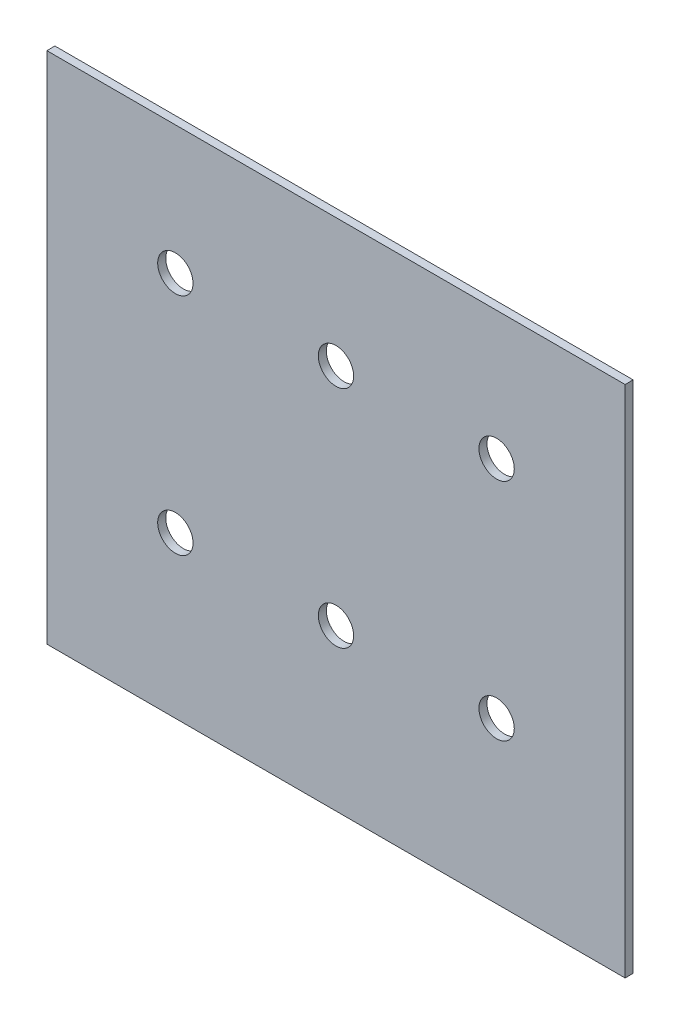
ISO-10303-21;
HEADER;
FILE_DESCRIPTION(('STEP AP214'),'2;1');
FILE_NAME('part.step','',(''),(''),'','','');
FILE_SCHEMA(('AUTOMOTIVE_DESIGN { 1 0 10303 214 1 1 1 1 }'));
ENDSEC;
DATA;
#1=APPLICATION_CONTEXT('core data for automotive mechanical design processes');
#2=APPLICATION_PROTOCOL_DEFINITION('international standard','automotive_design',2000,#1);
#3=PRODUCT_CONTEXT('',#1,'mechanical');
#4=PRODUCT('Part','Part','',(#3));
#5=PRODUCT_RELATED_PRODUCT_CATEGORY('part','',(#4));
#6=PRODUCT_DEFINITION_FORMATION('','',#4);
#7=PRODUCT_DEFINITION_CONTEXT('part definition',#1,'design');
#8=PRODUCT_DEFINITION('design','',#6,#7);
#9=PRODUCT_DEFINITION_SHAPE('','',#8);
#10=(LENGTH_UNIT() NAMED_UNIT(*) SI_UNIT(.MILLI.,.METRE.));
#11=(NAMED_UNIT(*) PLANE_ANGLE_UNIT() SI_UNIT($,.RADIAN.));
#12=(NAMED_UNIT(*) SI_UNIT($,.STERADIAN.) SOLID_ANGLE_UNIT());
#13=UNCERTAINTY_MEASURE_WITH_UNIT(LENGTH_MEASURE(1.E-05),#10,'distance_accuracy_value','');
#14=(GEOMETRIC_REPRESENTATION_CONTEXT(3) GLOBAL_UNCERTAINTY_ASSIGNED_CONTEXT((#13)) GLOBAL_UNIT_ASSIGNED_CONTEXT((#10,
#11,#12)) REPRESENTATION_CONTEXT('',''));
#15=CARTESIAN_POINT('',(0.,0.,0.));
#16=DIRECTION('',(0.,0.,1.));
#17=DIRECTION('',(1.,0.,0.));
#18=AXIS2_PLACEMENT_3D('',#15,#16,#17);
#19=CARTESIAN_POINT('',(0.,0.,5.));
#20=DIRECTION('',(0.,0.,1.));
#21=DIRECTION('',(1.,0.,0.));
#22=AXIS2_PLACEMENT_3D('',#19,#20,#21);
#23=PLANE('',#22);
#24=CARTESIAN_POINT('',(100.,-60.,5.));
#25=DIRECTION('',(0.,0.,1.));
#26=DIRECTION('',(1.,0.,0.));
#27=AXIS2_PLACEMENT_3D('',#24,#25,#26);
#28=CIRCLE('',#27,11.);
#29=CARTESIAN_POINT('',(111.,-60.,5.));
#30=VERTEX_POINT('',#29);
#31=EDGE_CURVE('E133',#30,#30,#28,.T.);
#32=ORIENTED_EDGE('',*,*,#31,.F.);
#33=EDGE_LOOP('',(#32));
#34=FACE_BOUND('',#33,.T.);
#35=CARTESIAN_POINT('',(-100.,80.,5.));
#36=DIRECTION('',(0.,0.,1.));
#37=DIRECTION('',(1.,0.,0.));
#38=AXIS2_PLACEMENT_3D('',#35,#36,#37);
#39=CIRCLE('',#38,11.);
#40=CARTESIAN_POINT('',(-89.,80.,5.));
#41=VERTEX_POINT('',#40);
#42=EDGE_CURVE('E121',#41,#41,#39,.T.);
#43=ORIENTED_EDGE('',*,*,#42,.F.);
#44=EDGE_LOOP('',(#43));
#45=FACE_BOUND('',#44,.T.);
#46=CARTESIAN_POINT('',(0.,80.,5.));
#47=DIRECTION('',(0.,0.,1.));
#48=DIRECTION('',(1.,0.,0.));
#49=AXIS2_PLACEMENT_3D('',#46,#47,#48);
#50=CIRCLE('',#49,11.);
#51=CARTESIAN_POINT('',(11.,80.,5.));
#52=VERTEX_POINT('',#51);
#53=EDGE_CURVE('E100',#52,#52,#50,.T.);
#54=ORIENTED_EDGE('',*,*,#53,.F.);
#55=EDGE_LOOP('',(#54));
#56=FACE_BOUND('',#55,.T.);
#57=DIRECTION('',(0.,1.,0.));
#58=VECTOR('',#57,1.);
#59=CARTESIAN_POINT('',(180.,160.,5.));
#60=LINE('',#59,#58);
#61=CARTESIAN_POINT('',(180.,-160.,5.));
#62=VERTEX_POINT('',#61);
#63=CARTESIAN_POINT('',(180.,160.,5.));
#64=VERTEX_POINT('',#63);
#65=EDGE_CURVE('E85',#62,#64,#60,.T.);
#66=ORIENTED_EDGE('',*,*,#65,.T.);
#67=DIRECTION('',(-1.,0.,0.));
#68=VECTOR('',#67,1.);
#69=CARTESIAN_POINT('',(-180.,160.,5.));
#70=LINE('',#69,#68);
#71=CARTESIAN_POINT('',(-180.,160.,5.));
#72=VERTEX_POINT('',#71);
#73=EDGE_CURVE('E80',#64,#72,#70,.T.);
#74=ORIENTED_EDGE('',*,*,#73,.T.);
#75=DIRECTION('',(0.,-1.,0.));
#76=VECTOR('',#75,1.);
#77=CARTESIAN_POINT('',(-180.,160.,5.));
#78=LINE('',#77,#76);
#79=CARTESIAN_POINT('',(-180.,-160.,5.));
#80=VERTEX_POINT('',#79);
#81=EDGE_CURVE('E83',#72,#80,#78,.T.);
#82=ORIENTED_EDGE('',*,*,#81,.T.);
#83=DIRECTION('',(1.,0.,0.));
#84=VECTOR('',#83,1.);
#85=CARTESIAN_POINT('',(-180.,-160.,5.));
#86=LINE('',#85,#84);
#87=EDGE_CURVE('E50',#80,#62,#86,.T.);
#88=ORIENTED_EDGE('',*,*,#87,.T.);
#89=EDGE_LOOP('',(#66,#74,#82,#88));
#90=FACE_BOUND('',#89,.T.);
#91=CARTESIAN_POINT('',(100.,80.,5.));
#92=DIRECTION('',(0.,0.,1.));
#93=DIRECTION('',(1.,0.,0.));
#94=AXIS2_PLACEMENT_3D('',#91,#92,#93);
#95=CIRCLE('',#94,11.);
#96=CARTESIAN_POINT('',(111.,80.,5.));
#97=VERTEX_POINT('',#96);
#98=EDGE_CURVE('E115',#97,#97,#95,.T.);
#99=ORIENTED_EDGE('',*,*,#98,.F.);
#100=EDGE_LOOP('',(#99));
#101=FACE_BOUND('',#100,.T.);
#102=CARTESIAN_POINT('',(0.,-60.,5.));
#103=DIRECTION('',(0.,0.,1.));
#104=DIRECTION('',(1.,0.,0.));
#105=AXIS2_PLACEMENT_3D('',#102,#103,#104);
#106=CIRCLE('',#105,11.);
#107=CARTESIAN_POINT('',(11.0000000000001,-60.,5.));
#108=VERTEX_POINT('',#107);
#109=EDGE_CURVE('E127',#108,#108,#106,.T.);
#110=ORIENTED_EDGE('',*,*,#109,.F.);
#111=EDGE_LOOP('',(#110));
#112=FACE_BOUND('',#111,.T.);
#113=CARTESIAN_POINT('',(-99.9999999999999,-60.,5.));
#114=DIRECTION('',(0.,0.,1.));
#115=DIRECTION('',(1.,0.,0.));
#116=AXIS2_PLACEMENT_3D('',#113,#114,#115);
#117=CIRCLE('',#116,11.);
#118=CARTESIAN_POINT('',(-89.,-60.,5.));
#119=VERTEX_POINT('',#118);
#120=EDGE_CURVE('E139',#119,#119,#117,.T.);
#121=ORIENTED_EDGE('',*,*,#120,.F.);
#122=EDGE_LOOP('',(#121));
#123=FACE_BOUND('',#122,.T.);
#124=ADVANCED_FACE('F33',(#34,#45,#56,#90,#101,#112,#123),#23,.T.);
#125=CARTESIAN_POINT('',(0.,0.,0.));
#126=DIRECTION('',(0.,0.,1.));
#127=DIRECTION('',(1.,0.,0.));
#128=AXIS2_PLACEMENT_3D('',#125,#126,#127);
#129=PLANE('',#128);
#130=DIRECTION('',(0.,1.,0.));
#131=VECTOR('',#130,1.);
#132=CARTESIAN_POINT('',(180.,160.,0.));
#133=LINE('',#132,#131);
#134=CARTESIAN_POINT('',(180.,-160.,0.));
#135=VERTEX_POINT('',#134);
#136=CARTESIAN_POINT('',(180.,160.,0.));
#137=VERTEX_POINT('',#136);
#138=EDGE_CURVE('E97',#135,#137,#133,.T.);
#139=ORIENTED_EDGE('',*,*,#138,.F.);
#140=DIRECTION('',(1.,0.,0.));
#141=VECTOR('',#140,1.);
#142=CARTESIAN_POINT('',(-180.,-160.,0.));
#143=LINE('',#142,#141);
#144=CARTESIAN_POINT('',(-180.,-160.,0.));
#145=VERTEX_POINT('',#144);
#146=EDGE_CURVE('E73',#145,#135,#143,.T.);
#147=ORIENTED_EDGE('',*,*,#146,.F.);
#148=DIRECTION('',(0.,-1.,0.));
#149=VECTOR('',#148,1.);
#150=CARTESIAN_POINT('',(-180.,160.,0.));
#151=LINE('',#150,#149);
#152=CARTESIAN_POINT('',(-180.,160.,0.));
#153=VERTEX_POINT('',#152);
#154=EDGE_CURVE('E67',#153,#145,#151,.T.);
#155=ORIENTED_EDGE('',*,*,#154,.F.);
#156=DIRECTION('',(-1.,0.,0.));
#157=VECTOR('',#156,1.);
#158=CARTESIAN_POINT('',(-180.,160.,0.));
#159=LINE('',#158,#157);
#160=EDGE_CURVE('E89',#137,#153,#159,.T.);
#161=ORIENTED_EDGE('',*,*,#160,.F.);
#162=EDGE_LOOP('',(#139,#147,#155,#161));
#163=FACE_BOUND('',#162,.T.);
#164=CARTESIAN_POINT('',(0.,80.,0.));
#165=DIRECTION('',(0.,0.,1.));
#166=DIRECTION('',(1.,0.,0.));
#167=AXIS2_PLACEMENT_3D('',#164,#165,#166);
#168=CIRCLE('',#167,11.);
#169=CARTESIAN_POINT('',(11.,80.,0.));
#170=VERTEX_POINT('',#169);
#171=EDGE_CURVE('E112',#170,#170,#168,.T.);
#172=ORIENTED_EDGE('',*,*,#171,.T.);
#173=EDGE_LOOP('',(#172));
#174=FACE_BOUND('',#173,.T.);
#175=CARTESIAN_POINT('',(100.,80.,0.));
#176=DIRECTION('',(0.,0.,1.));
#177=DIRECTION('',(1.,0.,0.));
#178=AXIS2_PLACEMENT_3D('',#175,#176,#177);
#179=CIRCLE('',#178,11.);
#180=CARTESIAN_POINT('',(111.,80.,0.));
#181=VERTEX_POINT('',#180);
#182=EDGE_CURVE('E118',#181,#181,#179,.T.);
#183=ORIENTED_EDGE('',*,*,#182,.T.);
#184=EDGE_LOOP('',(#183));
#185=FACE_BOUND('',#184,.T.);
#186=CARTESIAN_POINT('',(-100.,80.,0.));
#187=DIRECTION('',(0.,0.,1.));
#188=DIRECTION('',(1.,0.,0.));
#189=AXIS2_PLACEMENT_3D('',#186,#187,#188);
#190=CIRCLE('',#189,11.);
#191=CARTESIAN_POINT('',(-89.,80.,0.));
#192=VERTEX_POINT('',#191);
#193=EDGE_CURVE('E124',#192,#192,#190,.T.);
#194=ORIENTED_EDGE('',*,*,#193,.T.);
#195=EDGE_LOOP('',(#194));
#196=FACE_BOUND('',#195,.T.);
#197=CARTESIAN_POINT('',(0.,-60.,0.));
#198=DIRECTION('',(0.,0.,1.));
#199=DIRECTION('',(1.,0.,0.));
#200=AXIS2_PLACEMENT_3D('',#197,#198,#199);
#201=CIRCLE('',#200,11.);
#202=CARTESIAN_POINT('',(11.0000000000001,-60.,0.));
#203=VERTEX_POINT('',#202);
#204=EDGE_CURVE('E130',#203,#203,#201,.T.);
#205=ORIENTED_EDGE('',*,*,#204,.T.);
#206=EDGE_LOOP('',(#205));
#207=FACE_BOUND('',#206,.T.);
#208=CARTESIAN_POINT('',(100.,-60.,0.));
#209=DIRECTION('',(0.,0.,1.));
#210=DIRECTION('',(1.,0.,0.));
#211=AXIS2_PLACEMENT_3D('',#208,#209,#210);
#212=CIRCLE('',#211,11.);
#213=CARTESIAN_POINT('',(111.,-60.,0.));
#214=VERTEX_POINT('',#213);
#215=EDGE_CURVE('E136',#214,#214,#212,.T.);
#216=ORIENTED_EDGE('',*,*,#215,.T.);
#217=EDGE_LOOP('',(#216));
#218=FACE_BOUND('',#217,.T.);
#219=CARTESIAN_POINT('',(-99.9999999999999,-60.,0.));
#220=DIRECTION('',(0.,0.,1.));
#221=DIRECTION('',(1.,0.,0.));
#222=AXIS2_PLACEMENT_3D('',#219,#220,#221);
#223=CIRCLE('',#222,11.);
#224=CARTESIAN_POINT('',(-89.,-60.,0.));
#225=VERTEX_POINT('',#224);
#226=EDGE_CURVE('E142',#225,#225,#223,.T.);
#227=ORIENTED_EDGE('',*,*,#226,.T.);
#228=EDGE_LOOP('',(#227));
#229=FACE_BOUND('',#228,.T.);
#230=ADVANCED_FACE('F108',(#163,#174,#185,#196,#207,#218,#229),#129,.F.);
#231=CARTESIAN_POINT('',(180.,160.,5.));
#232=DIRECTION('',(-1.,0.,0.));
#233=DIRECTION('',(0.,-1.,0.));
#234=AXIS2_PLACEMENT_3D('',#231,#232,#233);
#235=PLANE('',#234);
#236=ORIENTED_EDGE('',*,*,#138,.T.);
#237=DIRECTION('',(0.,0.,-1.));
#238=VECTOR('',#237,1.);
#239=CARTESIAN_POINT('',(180.,160.,5.));
#240=LINE('',#239,#238);
#241=EDGE_CURVE('E11',#64,#137,#240,.T.);
#242=ORIENTED_EDGE('',*,*,#241,.F.);
#243=ORIENTED_EDGE('',*,*,#65,.F.);
#244=DIRECTION('',(0.,0.,-1.));
#245=VECTOR('',#244,1.);
#246=CARTESIAN_POINT('',(180.,-160.,5.));
#247=LINE('',#246,#245);
#248=EDGE_CURVE('E93',#62,#135,#247,.T.);
#249=ORIENTED_EDGE('',*,*,#248,.T.);
#250=EDGE_LOOP('',(#236,#242,#243,#249));
#251=FACE_BOUND('',#250,.T.);
#252=ADVANCED_FACE('F35',(#251),#235,.F.);
#253=CARTESIAN_POINT('',(-180.,160.,5.));
#254=DIRECTION('',(0.,-1.,0.));
#255=DIRECTION('',(0.,0.,-1.));
#256=AXIS2_PLACEMENT_3D('',#253,#254,#255);
#257=PLANE('',#256);
#258=ORIENTED_EDGE('',*,*,#160,.T.);
#259=DIRECTION('',(0.,0.,-1.));
#260=VECTOR('',#259,1.);
#261=CARTESIAN_POINT('',(-180.,160.,5.));
#262=LINE('',#261,#260);
#263=EDGE_CURVE('E42',#72,#153,#262,.T.);
#264=ORIENTED_EDGE('',*,*,#263,.F.);
#265=ORIENTED_EDGE('',*,*,#73,.F.);
#266=ORIENTED_EDGE('',*,*,#241,.T.);
#267=EDGE_LOOP('',(#258,#264,#265,#266));
#268=FACE_BOUND('',#267,.T.);
#269=ADVANCED_FACE('F88',(#268),#257,.F.);
#270=CARTESIAN_POINT('',(-180.,160.,5.));
#271=DIRECTION('',(1.,0.,0.));
#272=DIRECTION('',(0.,1.,0.));
#273=AXIS2_PLACEMENT_3D('',#270,#271,#272);
#274=PLANE('',#273);
#275=ORIENTED_EDGE('',*,*,#154,.T.);
#276=DIRECTION('',(0.,0.,-1.));
#277=VECTOR('',#276,1.);
#278=CARTESIAN_POINT('',(-180.,-160.,5.));
#279=LINE('',#278,#277);
#280=EDGE_CURVE('E90',#80,#145,#279,.T.);
#281=ORIENTED_EDGE('',*,*,#280,.F.);
#282=ORIENTED_EDGE('',*,*,#81,.F.);
#283=ORIENTED_EDGE('',*,*,#263,.T.);
#284=EDGE_LOOP('',(#275,#281,#282,#283));
#285=FACE_BOUND('',#284,.T.);
#286=ADVANCED_FACE('F91',(#285),#274,.F.);
#287=CARTESIAN_POINT('',(-180.,-160.,5.));
#288=DIRECTION('',(0.,1.,0.));
#289=DIRECTION('',(0.,0.,1.));
#290=AXIS2_PLACEMENT_3D('',#287,#288,#289);
#291=PLANE('',#290);
#292=ORIENTED_EDGE('',*,*,#146,.T.);
#293=ORIENTED_EDGE('',*,*,#248,.F.);
#294=ORIENTED_EDGE('',*,*,#87,.F.);
#295=ORIENTED_EDGE('',*,*,#280,.T.);
#296=EDGE_LOOP('',(#292,#293,#294,#295));
#297=FACE_BOUND('',#296,.T.);
#298=ADVANCED_FACE('F105',(#297),#291,.F.);
#299=CARTESIAN_POINT('',(0.,80.,5.));
#300=DIRECTION('',(0.,0.,-1.));
#301=DIRECTION('',(-1.,0.,0.));
#302=AXIS2_PLACEMENT_3D('',#299,#300,#301);
#303=CYLINDRICAL_SURFACE('',#302,11.);
#304=ORIENTED_EDGE('',*,*,#53,.T.);
#305=EDGE_LOOP('',(#304));
#306=FACE_BOUND('',#305,.T.);
#307=ORIENTED_EDGE('',*,*,#171,.F.);
#308=EDGE_LOOP('',(#307));
#309=FACE_BOUND('',#308,.T.);
#310=ADVANCED_FACE('F161',(#306,#309),#303,.F.);
#311=CARTESIAN_POINT('',(100.,80.,5.));
#312=DIRECTION('',(0.,0.,-1.));
#313=DIRECTION('',(-1.,0.,0.));
#314=AXIS2_PLACEMENT_3D('',#311,#312,#313);
#315=CYLINDRICAL_SURFACE('',#314,11.);
#316=ORIENTED_EDGE('',*,*,#98,.T.);
#317=EDGE_LOOP('',(#316));
#318=FACE_BOUND('',#317,.T.);
#319=ORIENTED_EDGE('',*,*,#182,.F.);
#320=EDGE_LOOP('',(#319));
#321=FACE_BOUND('',#320,.T.);
#322=ADVANCED_FACE('F207',(#318,#321),#315,.F.);
#323=CARTESIAN_POINT('',(-100.,80.,5.));
#324=DIRECTION('',(0.,0.,-1.));
#325=DIRECTION('',(-1.,0.,0.));
#326=AXIS2_PLACEMENT_3D('',#323,#324,#325);
#327=CYLINDRICAL_SURFACE('',#326,11.);
#328=ORIENTED_EDGE('',*,*,#42,.T.);
#329=EDGE_LOOP('',(#328));
#330=FACE_BOUND('',#329,.T.);
#331=ORIENTED_EDGE('',*,*,#193,.F.);
#332=EDGE_LOOP('',(#331));
#333=FACE_BOUND('',#332,.T.);
#334=ADVANCED_FACE('F215',(#330,#333),#327,.F.);
#335=CARTESIAN_POINT('',(0.,-60.,5.));
#336=DIRECTION('',(0.,0.,-1.));
#337=DIRECTION('',(-1.,0.,0.));
#338=AXIS2_PLACEMENT_3D('',#335,#336,#337);
#339=CYLINDRICAL_SURFACE('',#338,11.);
#340=ORIENTED_EDGE('',*,*,#109,.T.);
#341=EDGE_LOOP('',(#340));
#342=FACE_BOUND('',#341,.T.);
#343=ORIENTED_EDGE('',*,*,#204,.F.);
#344=EDGE_LOOP('',(#343));
#345=FACE_BOUND('',#344,.T.);
#346=ADVANCED_FACE('F223',(#342,#345),#339,.F.);
#347=CARTESIAN_POINT('',(100.,-60.,5.));
#348=DIRECTION('',(0.,0.,-1.));
#349=DIRECTION('',(-1.,0.,0.));
#350=AXIS2_PLACEMENT_3D('',#347,#348,#349);
#351=CYLINDRICAL_SURFACE('',#350,11.);
#352=ORIENTED_EDGE('',*,*,#31,.T.);
#353=EDGE_LOOP('',(#352));
#354=FACE_BOUND('',#353,.T.);
#355=ORIENTED_EDGE('',*,*,#215,.F.);
#356=EDGE_LOOP('',(#355));
#357=FACE_BOUND('',#356,.T.);
#358=ADVANCED_FACE('F232',(#354,#357),#351,.F.);
#359=CARTESIAN_POINT('',(-99.9999999999999,-60.,5.));
#360=DIRECTION('',(0.,0.,-1.));
#361=DIRECTION('',(-1.,0.,0.));
#362=AXIS2_PLACEMENT_3D('',#359,#360,#361);
#363=CYLINDRICAL_SURFACE('',#362,11.);
#364=ORIENTED_EDGE('',*,*,#120,.T.);
#365=EDGE_LOOP('',(#364));
#366=FACE_BOUND('',#365,.T.);
#367=ORIENTED_EDGE('',*,*,#226,.F.);
#368=EDGE_LOOP('',(#367));
#369=FACE_BOUND('',#368,.T.);
#370=ADVANCED_FACE('F148',(#366,#369),#363,.F.);
#371=CLOSED_SHELL('',(#124,#230,#252,#269,#286,#298,#310,#322,#334,#346,#358,#370));
#372=MANIFOLD_SOLID_BREP('B2',#371);
#373=ADVANCED_BREP_SHAPE_REPRESENTATION('',(#18,#372),#14);
#374=SHAPE_DEFINITION_REPRESENTATION(#9,#373);
ENDSEC;
END-ISO-10303-21;
